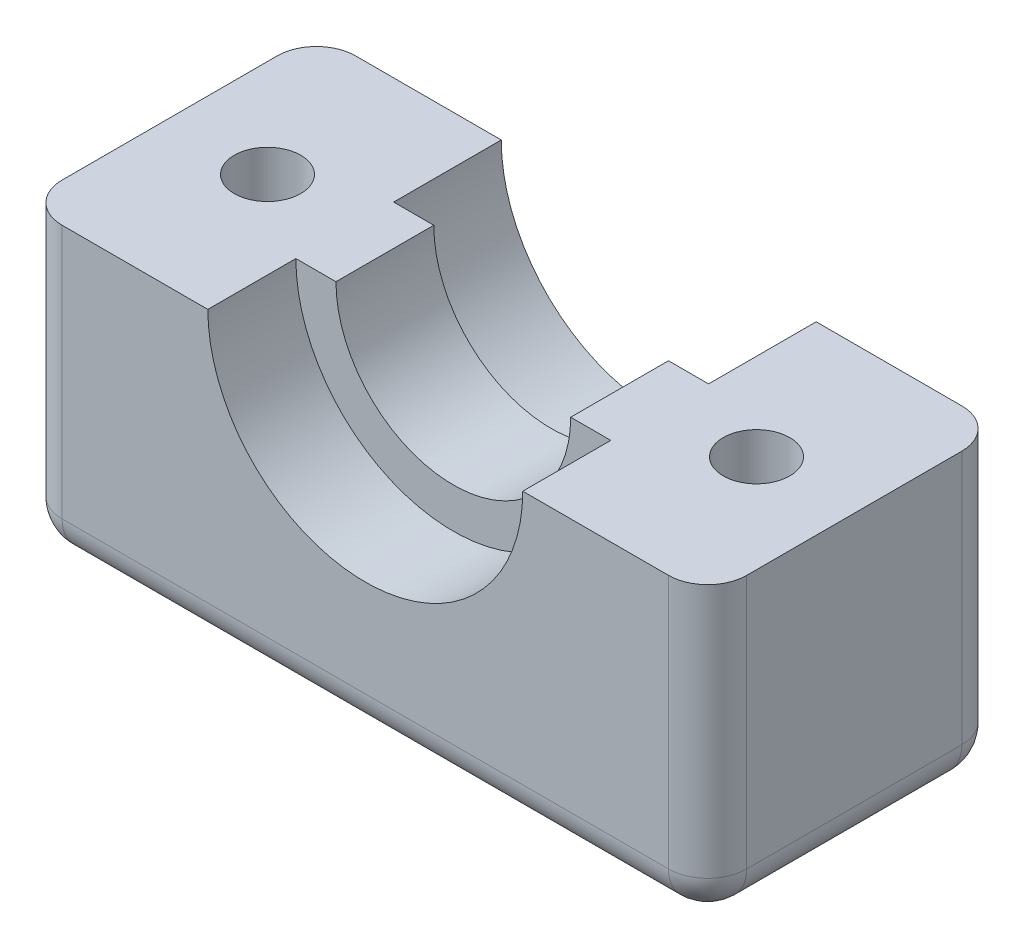
ISO-10303-21;
HEADER;
FILE_DESCRIPTION(('STEP AP214'),'2;1');
FILE_NAME('part.step','',(''),(''),'','','');
FILE_SCHEMA(('AUTOMOTIVE_DESIGN { 1 0 10303 214 1 1 1 1 }'));
ENDSEC;
DATA;
#1=APPLICATION_CONTEXT('core data for automotive mechanical design processes');
#2=APPLICATION_PROTOCOL_DEFINITION('international standard','automotive_design',2000,#1);
#3=PRODUCT_CONTEXT('',#1,'mechanical');
#4=PRODUCT('Part','Part','',(#3));
#5=PRODUCT_RELATED_PRODUCT_CATEGORY('part','',(#4));
#6=PRODUCT_DEFINITION_FORMATION('','',#4);
#7=PRODUCT_DEFINITION_CONTEXT('part definition',#1,'design');
#8=PRODUCT_DEFINITION('design','',#6,#7);
#9=PRODUCT_DEFINITION_SHAPE('','',#8);
#10=(LENGTH_UNIT() NAMED_UNIT(*) SI_UNIT(.MILLI.,.METRE.));
#11=(NAMED_UNIT(*) PLANE_ANGLE_UNIT() SI_UNIT($,.RADIAN.));
#12=(NAMED_UNIT(*) SI_UNIT($,.STERADIAN.) SOLID_ANGLE_UNIT());
#13=UNCERTAINTY_MEASURE_WITH_UNIT(LENGTH_MEASURE(1.E-05),#10,'distance_accuracy_value','');
#14=(GEOMETRIC_REPRESENTATION_CONTEXT(3) GLOBAL_UNCERTAINTY_ASSIGNED_CONTEXT((#13)) GLOBAL_UNIT_ASSIGNED_CONTEXT((#10,
#11,#12)) REPRESENTATION_CONTEXT('',''));
#15=CARTESIAN_POINT('',(0.,0.,0.));
#16=DIRECTION('',(0.,0.,1.));
#17=DIRECTION('',(1.,0.,0.));
#18=AXIS2_PLACEMENT_3D('',#15,#16,#17);
#19=CARTESIAN_POINT('',(2.,-89.498,191.5));
#20=DIRECTION('',(0.,-1.,0.));
#21=DIRECTION('',(0.,0.,-1.));
#22=AXIS2_PLACEMENT_3D('',#19,#20,#21);
#23=CYLINDRICAL_SURFACE('',#22,1.7);
#24=CARTESIAN_POINT('',(2.,-111.5,191.5));
#25=DIRECTION('',(0.,-1.,0.));
#26=DIRECTION('',(0.,0.,-1.));
#27=AXIS2_PLACEMENT_3D('',#24,#25,#26);
#28=CIRCLE('',#27,1.7);
#29=CARTESIAN_POINT('',(2.,-111.5,189.8));
#30=VERTEX_POINT('',#29);
#31=EDGE_CURVE('E356',#30,#30,#28,.T.);
#32=ORIENTED_EDGE('',*,*,#31,.F.);
#33=EDGE_LOOP('',(#32));
#34=FACE_BOUND('',#33,.T.);
#35=CARTESIAN_POINT('',(2.,-118.5,191.5));
#36=DIRECTION('',(0.,-1.,0.));
#37=DIRECTION('',(0.,0.,-1.));
#38=AXIS2_PLACEMENT_3D('',#35,#36,#37);
#39=CIRCLE('',#38,1.7);
#40=CARTESIAN_POINT('',(2.,-118.5,189.8));
#41=VERTEX_POINT('',#40);
#42=EDGE_CURVE('E344',#41,#41,#39,.T.);
#43=ORIENTED_EDGE('',*,*,#42,.T.);
#44=EDGE_LOOP('',(#43));
#45=FACE_BOUND('',#44,.T.);
#46=ADVANCED_FACE('F16',(#34,#45),#23,.F.);
#47=CARTESIAN_POINT('',(-23.,-89.498,191.5));
#48=DIRECTION('',(0.,-1.,0.));
#49=DIRECTION('',(0.,0.,-1.));
#50=AXIS2_PLACEMENT_3D('',#47,#48,#49);
#51=CYLINDRICAL_SURFACE('',#50,1.7);
#52=CARTESIAN_POINT('',(-23.,-111.5,191.5));
#53=DIRECTION('',(0.,-1.,0.));
#54=DIRECTION('',(0.,0.,-1.));
#55=AXIS2_PLACEMENT_3D('',#52,#53,#54);
#56=CIRCLE('',#55,1.7);
#57=CARTESIAN_POINT('',(-23.,-111.5,189.8));
#58=VERTEX_POINT('',#57);
#59=EDGE_CURVE('E187',#58,#58,#56,.T.);
#60=ORIENTED_EDGE('',*,*,#59,.F.);
#61=EDGE_LOOP('',(#60));
#62=FACE_BOUND('',#61,.T.);
#63=CARTESIAN_POINT('',(-23.,-118.5,191.5));
#64=DIRECTION('',(0.,-1.,0.));
#65=DIRECTION('',(0.,0.,-1.));
#66=AXIS2_PLACEMENT_3D('',#63,#64,#65);
#67=CIRCLE('',#66,1.7);
#68=CARTESIAN_POINT('',(-23.,-118.5,189.8));
#69=VERTEX_POINT('',#68);
#70=EDGE_CURVE('E360',#69,#69,#67,.T.);
#71=ORIENTED_EDGE('',*,*,#70,.T.);
#72=EDGE_LOOP('',(#71));
#73=FACE_BOUND('',#72,.T.);
#74=ADVANCED_FACE('F485',(#62,#73),#51,.F.);
#75=CARTESIAN_POINT('',(-10.5,-111.5,171.));
#76=DIRECTION('',(0.,-1.,0.));
#77=DIRECTION('',(1.,0.,0.));
#78=AXIS2_PLACEMENT_3D('',#75,#76,#77);
#79=PLANE('',#78);
#80=ORIENTED_EDGE('',*,*,#31,.T.);
#81=EDGE_LOOP('',(#80));
#82=FACE_BOUND('',#81,.T.);
#83=DIRECTION('',(-1.,0.,0.));
#84=VECTOR('',#83,1.);
#85=CARTESIAN_POINT('',(-10.5,-111.5,199.));
#86=LINE('',#85,#84);
#87=CARTESIAN_POINT('',(5.,-111.5,199.));
#88=VERTEX_POINT('',#87);
#89=CARTESIAN_POINT('',(-2.45,-111.5,199.));
#90=VERTEX_POINT('',#89);
#91=EDGE_CURVE('E215',#88,#90,#86,.T.);
#92=ORIENTED_EDGE('',*,*,#91,.F.);
#93=CARTESIAN_POINT('',(5.,-111.5,197.));
#94=DIRECTION('',(0.,-1.,0.));
#95=DIRECTION('',(0.,0.,-1.));
#96=AXIS2_PLACEMENT_3D('',#93,#94,#95);
#97=CIRCLE('',#96,2.);
#98=CARTESIAN_POINT('',(7.,-111.5,197.));
#99=VERTEX_POINT('',#98);
#100=EDGE_CURVE('E239',#88,#99,#97,.F.);
#101=ORIENTED_EDGE('',*,*,#100,.T.);
#102=DIRECTION('',(0.,0.,-1.));
#103=VECTOR('',#102,1.);
#104=CARTESIAN_POINT('',(7.,-111.5,191.5));
#105=LINE('',#104,#103);
#106=CARTESIAN_POINT('',(7.,-111.5,186.));
#107=VERTEX_POINT('',#106);
#108=EDGE_CURVE('E399',#99,#107,#105,.T.);
#109=ORIENTED_EDGE('',*,*,#108,.T.);
#110=CARTESIAN_POINT('',(5.,-111.5,186.));
#111=DIRECTION('',(0.,-1.,0.));
#112=DIRECTION('',(0.,0.,-1.));
#113=AXIS2_PLACEMENT_3D('',#110,#111,#112);
#114=CIRCLE('',#113,2.);
#115=CARTESIAN_POINT('',(5.,-111.5,184.));
#116=VERTEX_POINT('',#115);
#117=EDGE_CURVE('E236',#107,#116,#114,.F.);
#118=ORIENTED_EDGE('',*,*,#117,.T.);
#119=DIRECTION('',(-1.,0.,0.));
#120=VECTOR('',#119,1.);
#121=CARTESIAN_POINT('',(-10.5,-111.5,184.));
#122=LINE('',#121,#120);
#123=CARTESIAN_POINT('',(-2.45,-111.5,184.));
#124=VERTEX_POINT('',#123);
#125=EDGE_CURVE('E205',#116,#124,#122,.T.);
#126=ORIENTED_EDGE('',*,*,#125,.T.);
#127=DIRECTION('',(0.,0.,-1.));
#128=VECTOR('',#127,1.);
#129=CARTESIAN_POINT('',(-2.45,-111.5,189.5));
#130=LINE('',#129,#128);
#131=CARTESIAN_POINT('',(-2.45,-111.5,189.5));
#132=VERTEX_POINT('',#131);
#133=EDGE_CURVE('E181',#132,#124,#130,.T.);
#134=ORIENTED_EDGE('',*,*,#133,.F.);
#135=DIRECTION('',(1.,0.,0.));
#136=VECTOR('',#135,1.);
#137=CARTESIAN_POINT('',(-10.5,-111.5,189.5));
#138=LINE('',#137,#136);
#139=CARTESIAN_POINT('',(-4.5,-111.5,189.5));
#140=VERTEX_POINT('',#139);
#141=EDGE_CURVE('E371',#140,#132,#138,.T.);
#142=ORIENTED_EDGE('',*,*,#141,.F.);
#143=DIRECTION('',(0.,0.,1.));
#144=VECTOR('',#143,1.);
#145=CARTESIAN_POINT('',(-4.5,-111.5,174.));
#146=LINE('',#145,#144);
#147=CARTESIAN_POINT('',(-4.5,-111.5,194.5));
#148=VERTEX_POINT('',#147);
#149=EDGE_CURVE('E221',#140,#148,#146,.T.);
#150=ORIENTED_EDGE('',*,*,#149,.T.);
#151=DIRECTION('',(-1.,0.,0.));
#152=VECTOR('',#151,1.);
#153=CARTESIAN_POINT('',(-10.5,-111.5,194.5));
#154=LINE('',#153,#152);
#155=CARTESIAN_POINT('',(-2.45,-111.5,194.5));
#156=VERTEX_POINT('',#155);
#157=EDGE_CURVE('E391',#156,#148,#154,.T.);
#158=ORIENTED_EDGE('',*,*,#157,.F.);
#159=DIRECTION('',(0.,0.,1.));
#160=VECTOR('',#159,1.);
#161=CARTESIAN_POINT('',(-2.45,-111.5,194.5));
#162=LINE('',#161,#160);
#163=EDGE_CURVE('E395',#156,#90,#162,.T.);
#164=ORIENTED_EDGE('',*,*,#163,.T.);
#165=EDGE_LOOP('',(#92,#101,#109,#118,#126,#134,#142,#150,#158,#164));
#166=FACE_BOUND('',#165,.T.);
#167=ADVANCED_FACE('F430',(#82,#166),#79,.F.);
#168=ORIENTED_EDGE('',*,*,#59,.T.);
#169=EDGE_LOOP('',(#168));
#170=FACE_BOUND('',#169,.T.);
#171=DIRECTION('',(0.,0.,-1.));
#172=VECTOR('',#171,1.);
#173=CARTESIAN_POINT('',(-28.,-111.5,191.5));
#174=LINE('',#173,#172);
#175=CARTESIAN_POINT('',(-28.,-111.5,197.));
#176=VERTEX_POINT('',#175);
#177=CARTESIAN_POINT('',(-28.,-111.5,186.));
#178=VERTEX_POINT('',#177);
#179=EDGE_CURVE('E206',#176,#178,#174,.T.);
#180=ORIENTED_EDGE('',*,*,#179,.F.);
#181=CARTESIAN_POINT('',(-26.,-111.5,197.));
#182=DIRECTION('',(0.,-1.,0.));
#183=DIRECTION('',(0.,0.,-1.));
#184=AXIS2_PLACEMENT_3D('',#181,#182,#183);
#185=CIRCLE('',#184,2.);
#186=CARTESIAN_POINT('',(-26.,-111.5,199.));
#187=VERTEX_POINT('',#186);
#188=EDGE_CURVE('E263',#176,#187,#185,.F.);
#189=ORIENTED_EDGE('',*,*,#188,.T.);
#190=CARTESIAN_POINT('',(-18.55,-111.5,199.));
#191=VERTEX_POINT('',#190);
#192=EDGE_CURVE('E402',#191,#187,#86,.T.);
#193=ORIENTED_EDGE('',*,*,#192,.F.);
#194=DIRECTION('',(0.,0.,1.));
#195=VECTOR('',#194,1.);
#196=CARTESIAN_POINT('',(-18.55,-111.5,194.5));
#197=LINE('',#196,#195);
#198=CARTESIAN_POINT('',(-18.55,-111.5,194.5));
#199=VERTEX_POINT('',#198);
#200=EDGE_CURVE('E199',#191,#199,#197,.F.);
#201=ORIENTED_EDGE('',*,*,#200,.T.);
#202=DIRECTION('',(-1.,0.,0.));
#203=VECTOR('',#202,1.);
#204=CARTESIAN_POINT('',(-10.5,-111.5,194.5));
#205=LINE('',#204,#203);
#206=CARTESIAN_POINT('',(-16.5,-111.5,194.5));
#207=VERTEX_POINT('',#206);
#208=EDGE_CURVE('E385',#207,#199,#205,.T.);
#209=ORIENTED_EDGE('',*,*,#208,.F.);
#210=DIRECTION('',(0.,0.,1.));
#211=VECTOR('',#210,1.);
#212=CARTESIAN_POINT('',(-16.5,-111.5,174.));
#213=LINE('',#212,#211);
#214=CARTESIAN_POINT('',(-16.5,-111.5,189.5));
#215=VERTEX_POINT('',#214);
#216=EDGE_CURVE('E212',#207,#215,#213,.F.);
#217=ORIENTED_EDGE('',*,*,#216,.T.);
#218=DIRECTION('',(1.,0.,0.));
#219=VECTOR('',#218,1.);
#220=CARTESIAN_POINT('',(-10.5,-111.5,189.5));
#221=LINE('',#220,#219);
#222=CARTESIAN_POINT('',(-18.55,-111.5,189.5));
#223=VERTEX_POINT('',#222);
#224=EDGE_CURVE('E196',#223,#215,#221,.T.);
#225=ORIENTED_EDGE('',*,*,#224,.F.);
#226=DIRECTION('',(0.,0.,-1.));
#227=VECTOR('',#226,1.);
#228=CARTESIAN_POINT('',(-18.55,-111.5,189.5));
#229=LINE('',#228,#227);
#230=CARTESIAN_POINT('',(-18.55,-111.5,184.));
#231=VERTEX_POINT('',#230);
#232=EDGE_CURVE('E178',#231,#223,#229,.F.);
#233=ORIENTED_EDGE('',*,*,#232,.F.);
#234=CARTESIAN_POINT('',(-26.,-111.5,184.));
#235=VERTEX_POINT('',#234);
#236=EDGE_CURVE('E193',#231,#235,#122,.T.);
#237=ORIENTED_EDGE('',*,*,#236,.T.);
#238=CARTESIAN_POINT('',(-26.,-111.5,186.));
#239=DIRECTION('',(0.,-1.,0.));
#240=DIRECTION('',(0.,0.,-1.));
#241=AXIS2_PLACEMENT_3D('',#238,#239,#240);
#242=CIRCLE('',#241,2.);
#243=EDGE_CURVE('E260',#235,#178,#242,.F.);
#244=ORIENTED_EDGE('',*,*,#243,.T.);
#245=EDGE_LOOP('',(#180,#189,#193,#201,#209,#217,#225,#233,#237,#244));
#246=FACE_BOUND('',#245,.T.);
#247=ADVANCED_FACE('F192',(#170,#246),#79,.F.);
#248=CARTESIAN_POINT('',(-10.5,-111.5,174.));
#249=DIRECTION('',(0.,0.,1.));
#250=DIRECTION('',(1.,0.,0.));
#251=AXIS2_PLACEMENT_3D('',#248,#249,#250);
#252=CYLINDRICAL_SURFACE('',#251,6.);
#253=CARTESIAN_POINT('',(-10.5,-111.5,189.5));
#254=DIRECTION('',(0.,0.,1.));
#255=DIRECTION('',(-1.,0.,0.));
#256=AXIS2_PLACEMENT_3D('',#253,#254,#255);
#257=CIRCLE('',#256,6.);
#258=EDGE_CURVE('E366',#215,#140,#257,.T.);
#259=ORIENTED_EDGE('',*,*,#258,.F.);
#260=ORIENTED_EDGE('',*,*,#216,.F.);
#261=CARTESIAN_POINT('',(-10.5,-111.5,194.5));
#262=DIRECTION('',(0.,0.,1.));
#263=DIRECTION('',(1.,0.,0.));
#264=AXIS2_PLACEMENT_3D('',#261,#262,#263);
#265=CIRCLE('',#264,6.);
#266=EDGE_CURVE('E381',#207,#148,#265,.T.);
#267=ORIENTED_EDGE('',*,*,#266,.T.);
#268=ORIENTED_EDGE('',*,*,#149,.F.);
#269=EDGE_LOOP('',(#259,#260,#267,#268));
#270=FACE_BOUND('',#269,.T.);
#271=ADVANCED_FACE('F442',(#270),#252,.F.);
#272=CARTESIAN_POINT('',(-10.5,-126.5,199.));
#273=DIRECTION('',(0.,0.,-1.));
#274=DIRECTION('',(-1.,0.,0.));
#275=AXIS2_PLACEMENT_3D('',#272,#273,#274);
#276=PLANE('',#275);
#277=DIRECTION('',(-1.,0.,0.));
#278=VECTOR('',#277,1.);
#279=CARTESIAN_POINT('',(7.,-124.5,199.));
#280=LINE('',#279,#278);
#281=CARTESIAN_POINT('',(-26.,-124.5,199.));
#282=VERTEX_POINT('',#281);
#283=CARTESIAN_POINT('',(5.,-124.5,199.));
#284=VERTEX_POINT('',#283);
#285=EDGE_CURVE('E198',#282,#284,#280,.F.);
#286=ORIENTED_EDGE('',*,*,#285,.T.);
#287=DIRECTION('',(0.,1.,0.));
#288=VECTOR('',#287,1.);
#289=CARTESIAN_POINT('',(5.,-111.5,199.));
#290=LINE('',#289,#288);
#291=EDGE_CURVE('E232',#284,#88,#290,.T.);
#292=ORIENTED_EDGE('',*,*,#291,.T.);
#293=ORIENTED_EDGE('',*,*,#91,.T.);
#294=CARTESIAN_POINT('',(-10.5,-111.5,199.));
#295=DIRECTION('',(0.,0.,1.));
#296=DIRECTION('',(1.,0.,0.));
#297=AXIS2_PLACEMENT_3D('',#294,#295,#296);
#298=CIRCLE('',#297,8.05);
#299=EDGE_CURVE('E376',#191,#90,#298,.T.);
#300=ORIENTED_EDGE('',*,*,#299,.F.);
#301=ORIENTED_EDGE('',*,*,#192,.T.);
#302=DIRECTION('',(0.,1.,0.));
#303=VECTOR('',#302,1.);
#304=CARTESIAN_POINT('',(-26.,-126.5,199.));
#305=LINE('',#304,#303);
#306=EDGE_CURVE('E229',#187,#282,#305,.F.);
#307=ORIENTED_EDGE('',*,*,#306,.T.);
#308=EDGE_LOOP('',(#286,#292,#293,#300,#301,#307));
#309=FACE_BOUND('',#308,.T.);
#310=ADVANCED_FACE('F412',(#309),#276,.F.);
#311=CARTESIAN_POINT('',(7.,-126.5,191.5));
#312=DIRECTION('',(1.,0.,0.));
#313=DIRECTION('',(0.,0.,-1.));
#314=AXIS2_PLACEMENT_3D('',#311,#312,#313);
#315=PLANE('',#314);
#316=ORIENTED_EDGE('',*,*,#108,.F.);
#317=DIRECTION('',(0.,1.,0.));
#318=VECTOR('',#317,1.);
#319=CARTESIAN_POINT('',(7.,-126.5,197.));
#320=LINE('',#319,#318);
#321=CARTESIAN_POINT('',(7.,-124.5,197.));
#322=VERTEX_POINT('',#321);
#323=EDGE_CURVE('E248',#99,#322,#320,.F.);
#324=ORIENTED_EDGE('',*,*,#323,.T.);
#325=DIRECTION('',(0.,0.,-1.));
#326=VECTOR('',#325,1.);
#327=CARTESIAN_POINT('',(7.,-124.5,191.5));
#328=LINE('',#327,#326);
#329=CARTESIAN_POINT('',(7.,-124.5,186.));
#330=VERTEX_POINT('',#329);
#331=EDGE_CURVE('E242',#322,#330,#328,.T.);
#332=ORIENTED_EDGE('',*,*,#331,.T.);
#333=DIRECTION('',(0.,1.,0.));
#334=VECTOR('',#333,1.);
#335=CARTESIAN_POINT('',(7.,-126.5,186.));
#336=LINE('',#335,#334);
#337=EDGE_CURVE('E245',#330,#107,#336,.T.);
#338=ORIENTED_EDGE('',*,*,#337,.T.);
#339=EDGE_LOOP('',(#316,#324,#332,#338));
#340=FACE_BOUND('',#339,.T.);
#341=ADVANCED_FACE('F531',(#340),#315,.T.);
#342=CARTESIAN_POINT('',(-28.,-126.5,191.5));
#343=DIRECTION('',(1.,0.,0.));
#344=DIRECTION('',(0.,0.,-1.));
#345=AXIS2_PLACEMENT_3D('',#342,#343,#344);
#346=PLANE('',#345);
#347=DIRECTION('',(0.,0.,-1.));
#348=VECTOR('',#347,1.);
#349=CARTESIAN_POINT('',(-28.,-124.5,199.));
#350=LINE('',#349,#348);
#351=CARTESIAN_POINT('',(-28.,-124.5,186.));
#352=VERTEX_POINT('',#351);
#353=CARTESIAN_POINT('',(-28.,-124.5,197.));
#354=VERTEX_POINT('',#353);
#355=EDGE_CURVE('E251',#352,#354,#350,.F.);
#356=ORIENTED_EDGE('',*,*,#355,.T.);
#357=DIRECTION('',(0.,1.,0.));
#358=VECTOR('',#357,1.);
#359=CARTESIAN_POINT('',(-28.,-126.5,197.));
#360=LINE('',#359,#358);
#361=EDGE_CURVE('E257',#354,#176,#360,.T.);
#362=ORIENTED_EDGE('',*,*,#361,.T.);
#363=ORIENTED_EDGE('',*,*,#179,.T.);
#364=DIRECTION('',(0.,1.,0.));
#365=VECTOR('',#364,1.);
#366=CARTESIAN_POINT('',(-28.,-126.5,186.));
#367=LINE('',#366,#365);
#368=EDGE_CURVE('E254',#178,#352,#367,.F.);
#369=ORIENTED_EDGE('',*,*,#368,.T.);
#370=EDGE_LOOP('',(#356,#362,#363,#369));
#371=FACE_BOUND('',#370,.T.);
#372=ADVANCED_FACE('F462',(#371),#346,.F.);
#373=CARTESIAN_POINT('',(-10.5,-126.5,184.));
#374=DIRECTION('',(0.,0.,-1.));
#375=DIRECTION('',(-1.,0.,0.));
#376=AXIS2_PLACEMENT_3D('',#373,#374,#375);
#377=PLANE('',#376);
#378=DIRECTION('',(-1.,0.,0.));
#379=VECTOR('',#378,1.);
#380=CARTESIAN_POINT('',(-10.5,-124.5,184.));
#381=LINE('',#380,#379);
#382=CARTESIAN_POINT('',(5.,-124.5,184.));
#383=VERTEX_POINT('',#382);
#384=CARTESIAN_POINT('',(-26.,-124.5,184.));
#385=VERTEX_POINT('',#384);
#386=EDGE_CURVE('E266',#383,#385,#381,.T.);
#387=ORIENTED_EDGE('',*,*,#386,.T.);
#388=DIRECTION('',(0.,1.,0.));
#389=VECTOR('',#388,1.);
#390=CARTESIAN_POINT('',(-26.,-111.5,184.));
#391=LINE('',#390,#389);
#392=EDGE_CURVE('E203',#385,#235,#391,.T.);
#393=ORIENTED_EDGE('',*,*,#392,.T.);
#394=ORIENTED_EDGE('',*,*,#236,.F.);
#395=CARTESIAN_POINT('',(-10.5,-111.5,184.));
#396=DIRECTION('',(0.,0.,1.));
#397=DIRECTION('',(-1.,0.,0.));
#398=AXIS2_PLACEMENT_3D('',#395,#396,#397);
#399=CIRCLE('',#398,8.05);
#400=EDGE_CURVE('E174',#231,#124,#399,.T.);
#401=ORIENTED_EDGE('',*,*,#400,.T.);
#402=ORIENTED_EDGE('',*,*,#125,.F.);
#403=DIRECTION('',(0.,1.,0.));
#404=VECTOR('',#403,1.);
#405=CARTESIAN_POINT('',(5.,-126.5,184.));
#406=LINE('',#405,#404);
#407=EDGE_CURVE('E269',#116,#383,#406,.F.);
#408=ORIENTED_EDGE('',*,*,#407,.T.);
#409=EDGE_LOOP('',(#387,#393,#394,#401,#402,#408));
#410=FACE_BOUND('',#409,.T.);
#411=ADVANCED_FACE('F201',(#410),#377,.T.);
#412=CARTESIAN_POINT('',(-10.5,-126.5,171.));
#413=DIRECTION('',(0.,-1.,0.));
#414=DIRECTION('',(1.,0.,0.));
#415=AXIS2_PLACEMENT_3D('',#412,#413,#414);
#416=PLANE('',#415);
#417=DIRECTION('',(0.,0.,-1.));
#418=VECTOR('',#417,1.);
#419=CARTESIAN_POINT('',(5.,-126.5,171.));
#420=LINE('',#419,#418);
#421=CARTESIAN_POINT('',(5.,-126.5,191.5));
#422=VERTEX_POINT('',#421);
#423=CARTESIAN_POINT('',(5.,-126.5,197.));
#424=VERTEX_POINT('',#423);
#425=EDGE_CURVE('E26',#422,#424,#420,.F.);
#426=ORIENTED_EDGE('',*,*,#425,.T.);
#427=DIRECTION('',(-1.,0.,0.));
#428=VECTOR('',#427,1.);
#429=CARTESIAN_POINT('',(-28.,-126.5,197.));
#430=LINE('',#429,#428);
#431=CARTESIAN_POINT('',(-26.,-126.5,197.));
#432=VERTEX_POINT('',#431);
#433=EDGE_CURVE('E10',#424,#432,#430,.T.);
#434=ORIENTED_EDGE('',*,*,#433,.T.);
#435=DIRECTION('',(0.,0.,-1.));
#436=VECTOR('',#435,1.);
#437=CARTESIAN_POINT('',(-26.,-126.5,184.));
#438=LINE('',#437,#436);
#439=CARTESIAN_POINT('',(-26.,-126.5,191.5));
#440=VERTEX_POINT('',#439);
#441=EDGE_CURVE('E283',#432,#440,#438,.T.);
#442=ORIENTED_EDGE('',*,*,#441,.T.);
#443=CARTESIAN_POINT('',(-23.,-126.5,191.5));
#444=DIRECTION('',(0.,-1.,0.));
#445=DIRECTION('',(0.,0.,-1.));
#446=AXIS2_PLACEMENT_3D('',#443,#444,#445);
#447=CIRCLE('',#446,3.);
#448=EDGE_CURVE('E469',#440,#440,#447,.T.);
#449=ORIENTED_EDGE('',*,*,#448,.F.);
#450=DIRECTION('',(0.,0.,-1.));
#451=VECTOR('',#450,1.);
#452=CARTESIAN_POINT('',(-26.,-126.5,184.));
#453=LINE('',#452,#451);
#454=CARTESIAN_POINT('',(-26.,-126.5,186.));
#455=VERTEX_POINT('',#454);
#456=EDGE_CURVE('E280',#440,#455,#453,.T.);
#457=ORIENTED_EDGE('',*,*,#456,.T.);
#458=DIRECTION('',(-1.,0.,0.));
#459=VECTOR('',#458,1.);
#460=CARTESIAN_POINT('',(-10.5,-126.5,186.));
#461=LINE('',#460,#459);
#462=CARTESIAN_POINT('',(5.,-126.5,186.));
#463=VERTEX_POINT('',#462);
#464=EDGE_CURVE('E274',#455,#463,#461,.F.);
#465=ORIENTED_EDGE('',*,*,#464,.T.);
#466=DIRECTION('',(0.,0.,-1.));
#467=VECTOR('',#466,1.);
#468=CARTESIAN_POINT('',(5.,-126.5,171.));
#469=LINE('',#468,#467);
#470=EDGE_CURVE('E277',#463,#422,#469,.F.);
#471=ORIENTED_EDGE('',*,*,#470,.T.);
#472=CARTESIAN_POINT('',(2.,-126.5,191.5));
#473=DIRECTION('',(0.,-1.,0.));
#474=DIRECTION('',(0.,0.,-1.));
#475=AXIS2_PLACEMENT_3D('',#472,#473,#474);
#476=CIRCLE('',#475,3.);
#477=EDGE_CURVE('E337',#422,#422,#476,.T.);
#478=ORIENTED_EDGE('',*,*,#477,.F.);
#479=EDGE_LOOP('',(#426,#434,#442,#449,#457,#465,#471,#478));
#480=FACE_BOUND('',#479,.T.);
#481=ADVANCED_FACE('F468',(#480),#416,.T.);
#482=CARTESIAN_POINT('',(-10.5,-111.5,194.5));
#483=DIRECTION('',(0.,0.,1.));
#484=DIRECTION('',(1.,0.,0.));
#485=AXIS2_PLACEMENT_3D('',#482,#483,#484);
#486=CYLINDRICAL_SURFACE('',#485,8.05);
#487=CARTESIAN_POINT('',(-10.5,-111.5,194.5));
#488=DIRECTION('',(0.,0.,1.));
#489=DIRECTION('',(1.,0.,0.));
#490=AXIS2_PLACEMENT_3D('',#487,#488,#489);
#491=CIRCLE('',#490,8.05);
#492=EDGE_CURVE('E377',#199,#156,#491,.T.);
#493=ORIENTED_EDGE('',*,*,#492,.F.);
#494=ORIENTED_EDGE('',*,*,#200,.F.);
#495=ORIENTED_EDGE('',*,*,#299,.T.);
#496=ORIENTED_EDGE('',*,*,#163,.F.);
#497=EDGE_LOOP('',(#493,#494,#495,#496));
#498=FACE_BOUND('',#497,.T.);
#499=ADVANCED_FACE('F435',(#498),#486,.F.);
#500=CARTESIAN_POINT('',(-10.5,-107.025,194.5));
#501=DIRECTION('',(0.,0.,1.));
#502=DIRECTION('',(1.,0.,0.));
#503=AXIS2_PLACEMENT_3D('',#500,#501,#502);
#504=PLANE('',#503);
#505=ORIENTED_EDGE('',*,*,#157,.T.);
#506=ORIENTED_EDGE('',*,*,#266,.F.);
#507=ORIENTED_EDGE('',*,*,#208,.T.);
#508=ORIENTED_EDGE('',*,*,#492,.T.);
#509=EDGE_LOOP('',(#505,#506,#507,#508));
#510=FACE_BOUND('',#509,.T.);
#511=ADVANCED_FACE('F437',(#510),#504,.T.);
#512=CARTESIAN_POINT('',(-10.5,-111.5,189.5));
#513=DIRECTION('',(0.,0.,-1.));
#514=DIRECTION('',(-1.,0.,0.));
#515=AXIS2_PLACEMENT_3D('',#512,#513,#514);
#516=CYLINDRICAL_SURFACE('',#515,8.05);
#517=ORIENTED_EDGE('',*,*,#133,.T.);
#518=ORIENTED_EDGE('',*,*,#400,.F.);
#519=ORIENTED_EDGE('',*,*,#232,.T.);
#520=CARTESIAN_POINT('',(-10.5,-111.5,189.5));
#521=DIRECTION('',(0.,0.,1.));
#522=DIRECTION('',(-1.,0.,0.));
#523=AXIS2_PLACEMENT_3D('',#520,#521,#522);
#524=CIRCLE('',#523,8.05);
#525=EDGE_CURVE('E186',#223,#132,#524,.T.);
#526=ORIENTED_EDGE('',*,*,#525,.T.);
#527=EDGE_LOOP('',(#517,#518,#519,#526));
#528=FACE_BOUND('',#527,.T.);
#529=ADVANCED_FACE('F176',(#528),#516,.F.);
#530=CARTESIAN_POINT('',(-10.5,-114.975,189.5));
#531=DIRECTION('',(0.,0.,-1.));
#532=DIRECTION('',(1.,0.,0.));
#533=AXIS2_PLACEMENT_3D('',#530,#531,#532);
#534=PLANE('',#533);
#535=ORIENTED_EDGE('',*,*,#141,.T.);
#536=ORIENTED_EDGE('',*,*,#525,.F.);
#537=ORIENTED_EDGE('',*,*,#224,.T.);
#538=ORIENTED_EDGE('',*,*,#258,.T.);
#539=EDGE_LOOP('',(#535,#536,#537,#538));
#540=FACE_BOUND('',#539,.T.);
#541=ADVANCED_FACE('F446',(#540),#534,.T.);
#542=CARTESIAN_POINT('',(-23.,-118.5,191.5));
#543=DIRECTION('',(0.,-1.,0.));
#544=DIRECTION('',(0.,0.,-1.));
#545=AXIS2_PLACEMENT_3D('',#542,#543,#544);
#546=CYLINDRICAL_SURFACE('',#545,3.);
#547=CARTESIAN_POINT('',(-23.,-118.5,191.5));
#548=DIRECTION('',(0.,-1.,0.));
#549=DIRECTION('',(0.,0.,-1.));
#550=AXIS2_PLACEMENT_3D('',#547,#548,#549);
#551=CIRCLE('',#550,3.);
#552=CARTESIAN_POINT('',(-23.,-118.5,188.5));
#553=VERTEX_POINT('',#552);
#554=EDGE_CURVE('E473',#553,#553,#551,.T.);
#555=ORIENTED_EDGE('',*,*,#554,.F.);
#556=EDGE_LOOP('',(#555));
#557=FACE_BOUND('',#556,.T.);
#558=ORIENTED_EDGE('',*,*,#448,.T.);
#559=EDGE_LOOP('',(#558));
#560=FACE_BOUND('',#559,.T.);
#561=ADVANCED_FACE('F471',(#557,#560),#546,.F.);
#562=CARTESIAN_POINT('',(-10.5,-118.5,191.5));
#563=DIRECTION('',(0.,-1.,0.));
#564=DIRECTION('',(1.,0.,0.));
#565=AXIS2_PLACEMENT_3D('',#562,#563,#564);
#566=PLANE('',#565);
#567=ORIENTED_EDGE('',*,*,#70,.F.);
#568=EDGE_LOOP('',(#567));
#569=FACE_BOUND('',#568,.T.);
#570=ORIENTED_EDGE('',*,*,#554,.T.);
#571=EDGE_LOOP('',(#570));
#572=FACE_BOUND('',#571,.T.);
#573=ADVANCED_FACE('F487',(#569,#572),#566,.T.);
#574=CARTESIAN_POINT('',(2.,-118.5,191.5));
#575=DIRECTION('',(0.,-1.,0.));
#576=DIRECTION('',(0.,0.,-1.));
#577=AXIS2_PLACEMENT_3D('',#574,#575,#576);
#578=CYLINDRICAL_SURFACE('',#577,3.);
#579=CARTESIAN_POINT('',(2.,-118.5,191.5));
#580=DIRECTION('',(0.,-1.,0.));
#581=DIRECTION('',(0.,0.,-1.));
#582=AXIS2_PLACEMENT_3D('',#579,#580,#581);
#583=CIRCLE('',#582,3.);
#584=CARTESIAN_POINT('',(2.,-118.5,188.5));
#585=VERTEX_POINT('',#584);
#586=EDGE_CURVE('E352',#585,#585,#583,.T.);
#587=ORIENTED_EDGE('',*,*,#586,.F.);
#588=EDGE_LOOP('',(#587));
#589=FACE_BOUND('',#588,.T.);
#590=ORIENTED_EDGE('',*,*,#477,.T.);
#591=EDGE_LOOP('',(#590));
#592=FACE_BOUND('',#591,.T.);
#593=ADVANCED_FACE('F490',(#589,#592),#578,.F.);
#594=CARTESIAN_POINT('',(-10.5,-118.5,191.5));
#595=DIRECTION('',(0.,-1.,0.));
#596=DIRECTION('',(1.,0.,0.));
#597=AXIS2_PLACEMENT_3D('',#594,#595,#596);
#598=PLANE('',#597);
#599=ORIENTED_EDGE('',*,*,#42,.F.);
#600=EDGE_LOOP('',(#599));
#601=FACE_BOUND('',#600,.T.);
#602=ORIENTED_EDGE('',*,*,#586,.T.);
#603=EDGE_LOOP('',(#602));
#604=FACE_BOUND('',#603,.T.);
#605=ADVANCED_FACE('F566',(#601,#604),#598,.T.);
#606=CARTESIAN_POINT('',(-26.,-126.5,186.));
#607=DIRECTION('',(0.,-1.,0.));
#608=DIRECTION('',(0.,0.,-1.));
#609=AXIS2_PLACEMENT_3D('',#606,#607,#608);
#610=CYLINDRICAL_SURFACE('',#609,2.);
#611=CARTESIAN_POINT('',(-26.,-124.5,186.));
#612=DIRECTION('',(0.,-1.,0.));
#613=DIRECTION('',(0.,0.,-1.));
#614=AXIS2_PLACEMENT_3D('',#611,#612,#613);
#615=CIRCLE('',#614,2.);
#616=EDGE_CURVE('E20',#352,#385,#615,.T.);
#617=ORIENTED_EDGE('',*,*,#616,.F.);
#618=ORIENTED_EDGE('',*,*,#368,.F.);
#619=ORIENTED_EDGE('',*,*,#243,.F.);
#620=ORIENTED_EDGE('',*,*,#392,.F.);
#621=EDGE_LOOP('',(#617,#618,#619,#620));
#622=FACE_BOUND('',#621,.T.);
#623=ADVANCED_FACE('F18',(#622),#610,.T.);
#624=CARTESIAN_POINT('',(-26.,-124.5,186.));
#625=DIRECTION('',(0.,0.,1.));
#626=DIRECTION('',(1.,0.,0.));
#627=AXIS2_PLACEMENT_3D('',#624,#625,#626);
#628=SPHERICAL_SURFACE('',#627,2.);
#629=CARTESIAN_POINT('',(-26.,-124.5,186.));
#630=DIRECTION('',(0.,0.,-1.));
#631=DIRECTION('',(-1.,0.,0.));
#632=AXIS2_PLACEMENT_3D('',#629,#630,#631);
#633=CIRCLE('',#632,2.);
#634=EDGE_CURVE('E324',#352,#455,#633,.F.);
#635=ORIENTED_EDGE('',*,*,#634,.F.);
#636=ORIENTED_EDGE('',*,*,#616,.T.);
#637=CARTESIAN_POINT('',(-26.,-124.5,186.));
#638=DIRECTION('',(-1.,0.,0.));
#639=DIRECTION('',(0.,-1.,0.));
#640=AXIS2_PLACEMENT_3D('',#637,#638,#639);
#641=CIRCLE('',#640,2.);
#642=EDGE_CURVE('E327',#455,#385,#641,.F.);
#643=ORIENTED_EDGE('',*,*,#642,.F.);
#644=EDGE_LOOP('',(#635,#636,#643));
#645=FACE_BOUND('',#644,.T.);
#646=ADVANCED_FACE('F561',(#645),#628,.T.);
#647=CARTESIAN_POINT('',(5.,-126.5,186.));
#648=DIRECTION('',(0.,1.,0.));
#649=DIRECTION('',(0.,0.,1.));
#650=AXIS2_PLACEMENT_3D('',#647,#648,#649);
#651=CYLINDRICAL_SURFACE('',#650,2.);
#652=ORIENTED_EDGE('',*,*,#117,.F.);
#653=ORIENTED_EDGE('',*,*,#337,.F.);
#654=CARTESIAN_POINT('',(5.,-124.5,186.));
#655=DIRECTION('',(0.,-1.,0.));
#656=DIRECTION('',(0.,0.,-1.));
#657=AXIS2_PLACEMENT_3D('',#654,#655,#656);
#658=CIRCLE('',#657,2.);
#659=EDGE_CURVE('E320',#383,#330,#658,.T.);
#660=ORIENTED_EDGE('',*,*,#659,.F.);
#661=ORIENTED_EDGE('',*,*,#407,.F.);
#662=EDGE_LOOP('',(#652,#653,#660,#661));
#663=FACE_BOUND('',#662,.T.);
#664=ADVANCED_FACE('F451',(#663),#651,.T.);
#665=CARTESIAN_POINT('',(-10.5,-124.5,186.));
#666=DIRECTION('',(-1.,0.,0.));
#667=DIRECTION('',(0.,0.,1.));
#668=AXIS2_PLACEMENT_3D('',#665,#666,#667);
#669=CYLINDRICAL_SURFACE('',#668,2.);
#670=ORIENTED_EDGE('',*,*,#642,.T.);
#671=ORIENTED_EDGE('',*,*,#386,.F.);
#672=CARTESIAN_POINT('',(5.,-124.5,186.));
#673=DIRECTION('',(1.,0.,0.));
#674=DIRECTION('',(0.,0.,-1.));
#675=AXIS2_PLACEMENT_3D('',#672,#673,#674);
#676=CIRCLE('',#675,2.);
#677=EDGE_CURVE('E316',#463,#383,#676,.T.);
#678=ORIENTED_EDGE('',*,*,#677,.F.);
#679=ORIENTED_EDGE('',*,*,#464,.F.);
#680=EDGE_LOOP('',(#670,#671,#678,#679));
#681=FACE_BOUND('',#680,.T.);
#682=ADVANCED_FACE('F458',(#681),#669,.T.);
#683=CARTESIAN_POINT('',(-26.,-124.5,171.));
#684=DIRECTION('',(0.,0.,1.));
#685=DIRECTION('',(1.,0.,0.));
#686=AXIS2_PLACEMENT_3D('',#683,#684,#685);
#687=CYLINDRICAL_SURFACE('',#686,2.);
#688=ORIENTED_EDGE('',*,*,#456,.F.);
#689=ORIENTED_EDGE('',*,*,#441,.F.);
#690=CARTESIAN_POINT('',(-26.,-124.5,197.));
#691=DIRECTION('',(0.,0.,1.));
#692=DIRECTION('',(1.,0.,0.));
#693=AXIS2_PLACEMENT_3D('',#690,#691,#692);
#694=CIRCLE('',#693,2.);
#695=EDGE_CURVE('E312',#354,#432,#694,.T.);
#696=ORIENTED_EDGE('',*,*,#695,.F.);
#697=ORIENTED_EDGE('',*,*,#355,.F.);
#698=ORIENTED_EDGE('',*,*,#634,.T.);
#699=EDGE_LOOP('',(#688,#689,#696,#697,#698));
#700=FACE_BOUND('',#699,.T.);
#701=ADVANCED_FACE('F465',(#700),#687,.T.);
#702=CARTESIAN_POINT('',(-26.,-126.5,197.));
#703=DIRECTION('',(0.,1.,0.));
#704=DIRECTION('',(0.,0.,1.));
#705=AXIS2_PLACEMENT_3D('',#702,#703,#704);
#706=CYLINDRICAL_SURFACE('',#705,2.);
#707=ORIENTED_EDGE('',*,*,#188,.F.);
#708=ORIENTED_EDGE('',*,*,#361,.F.);
#709=CARTESIAN_POINT('',(-26.,-124.5,197.));
#710=DIRECTION('',(0.,-1.,0.));
#711=DIRECTION('',(0.,0.,-1.));
#712=AXIS2_PLACEMENT_3D('',#709,#710,#711);
#713=CIRCLE('',#712,2.);
#714=EDGE_CURVE('E308',#282,#354,#713,.T.);
#715=ORIENTED_EDGE('',*,*,#714,.F.);
#716=ORIENTED_EDGE('',*,*,#306,.F.);
#717=EDGE_LOOP('',(#707,#708,#715,#716));
#718=FACE_BOUND('',#717,.T.);
#719=ADVANCED_FACE('F416',(#718),#706,.T.);
#720=CARTESIAN_POINT('',(5.,-124.5,186.));
#721=DIRECTION('',(0.,0.,1.));
#722=DIRECTION('',(1.,0.,0.));
#723=AXIS2_PLACEMENT_3D('',#720,#721,#722);
#724=SPHERICAL_SURFACE('',#723,2.);
#725=ORIENTED_EDGE('',*,*,#677,.T.);
#726=ORIENTED_EDGE('',*,*,#659,.T.);
#727=CARTESIAN_POINT('',(5.,-124.5,186.));
#728=DIRECTION('',(0.,0.,-1.));
#729=DIRECTION('',(-1.,0.,0.));
#730=AXIS2_PLACEMENT_3D('',#727,#728,#729);
#731=CIRCLE('',#730,2.);
#732=EDGE_CURVE('E304',#463,#330,#731,.F.);
#733=ORIENTED_EDGE('',*,*,#732,.F.);
#734=EDGE_LOOP('',(#725,#726,#733));
#735=FACE_BOUND('',#734,.T.);
#736=ADVANCED_FACE('F456',(#735),#724,.T.);
#737=CARTESIAN_POINT('',(-26.,-124.5,197.));
#738=DIRECTION('',(0.,0.,1.));
#739=DIRECTION('',(1.,0.,0.));
#740=AXIS2_PLACEMENT_3D('',#737,#738,#739);
#741=SPHERICAL_SURFACE('',#740,2.);
#742=ORIENTED_EDGE('',*,*,#714,.T.);
#743=ORIENTED_EDGE('',*,*,#695,.T.);
#744=CARTESIAN_POINT('',(-26.,-124.5,197.));
#745=DIRECTION('',(-1.,0.,0.));
#746=DIRECTION('',(0.,0.,1.));
#747=AXIS2_PLACEMENT_3D('',#744,#745,#746);
#748=CIRCLE('',#747,2.);
#749=EDGE_CURVE('E300',#282,#432,#748,.F.);
#750=ORIENTED_EDGE('',*,*,#749,.F.);
#751=EDGE_LOOP('',(#742,#743,#750));
#752=FACE_BOUND('',#751,.T.);
#753=ADVANCED_FACE('F422',(#752),#741,.T.);
#754=CARTESIAN_POINT('',(5.,-124.5,191.5));
#755=DIRECTION('',(0.,0.,-1.));
#756=DIRECTION('',(-1.,0.,0.));
#757=AXIS2_PLACEMENT_3D('',#754,#755,#756);
#758=CYLINDRICAL_SURFACE('',#757,2.);
#759=ORIENTED_EDGE('',*,*,#732,.T.);
#760=ORIENTED_EDGE('',*,*,#331,.F.);
#761=CARTESIAN_POINT('',(5.,-124.5,197.));
#762=DIRECTION('',(0.,0.,1.));
#763=DIRECTION('',(1.,0.,0.));
#764=AXIS2_PLACEMENT_3D('',#761,#762,#763);
#765=CIRCLE('',#764,2.);
#766=EDGE_CURVE('E296',#424,#322,#765,.T.);
#767=ORIENTED_EDGE('',*,*,#766,.F.);
#768=ORIENTED_EDGE('',*,*,#425,.F.);
#769=ORIENTED_EDGE('',*,*,#470,.F.);
#770=EDGE_LOOP('',(#759,#760,#767,#768,#769));
#771=FACE_BOUND('',#770,.T.);
#772=ADVANCED_FACE('F546',(#771),#758,.T.);
#773=CARTESIAN_POINT('',(-10.5,-124.5,197.));
#774=DIRECTION('',(1.,0.,0.));
#775=DIRECTION('',(0.,0.,-1.));
#776=AXIS2_PLACEMENT_3D('',#773,#774,#775);
#777=CYLINDRICAL_SURFACE('',#776,2.);
#778=ORIENTED_EDGE('',*,*,#749,.T.);
#779=ORIENTED_EDGE('',*,*,#433,.F.);
#780=CARTESIAN_POINT('',(5.,-124.5,197.));
#781=DIRECTION('',(1.,0.,0.));
#782=DIRECTION('',(0.,1.,0.));
#783=AXIS2_PLACEMENT_3D('',#780,#781,#782);
#784=CIRCLE('',#783,2.);
#785=EDGE_CURVE('E292',#284,#424,#784,.T.);
#786=ORIENTED_EDGE('',*,*,#785,.F.);
#787=ORIENTED_EDGE('',*,*,#285,.F.);
#788=EDGE_LOOP('',(#778,#779,#786,#787));
#789=FACE_BOUND('',#788,.T.);
#790=ADVANCED_FACE('F425',(#789),#777,.T.);
#791=CARTESIAN_POINT('',(5.,-124.5,197.));
#792=DIRECTION('',(0.,0.,1.));
#793=DIRECTION('',(1.,0.,0.));
#794=AXIS2_PLACEMENT_3D('',#791,#792,#793);
#795=SPHERICAL_SURFACE('',#794,2.);
#796=ORIENTED_EDGE('',*,*,#785,.T.);
#797=ORIENTED_EDGE('',*,*,#766,.T.);
#798=CARTESIAN_POINT('',(5.,-124.5,197.));
#799=DIRECTION('',(0.,-1.,0.));
#800=DIRECTION('',(0.,0.,-1.));
#801=AXIS2_PLACEMENT_3D('',#798,#799,#800);
#802=CIRCLE('',#801,2.);
#803=EDGE_CURVE('E288',#284,#322,#802,.F.);
#804=ORIENTED_EDGE('',*,*,#803,.F.);
#805=EDGE_LOOP('',(#796,#797,#804));
#806=FACE_BOUND('',#805,.T.);
#807=ADVANCED_FACE('F540',(#806),#795,.T.);
#808=CARTESIAN_POINT('',(5.,-126.5,197.));
#809=DIRECTION('',(0.,-1.,0.));
#810=DIRECTION('',(0.,0.,-1.));
#811=AXIS2_PLACEMENT_3D('',#808,#809,#810);
#812=CYLINDRICAL_SURFACE('',#811,2.);
#813=ORIENTED_EDGE('',*,*,#803,.T.);
#814=ORIENTED_EDGE('',*,*,#323,.F.);
#815=ORIENTED_EDGE('',*,*,#100,.F.);
#816=ORIENTED_EDGE('',*,*,#291,.F.);
#817=EDGE_LOOP('',(#813,#814,#815,#816));
#818=FACE_BOUND('',#817,.T.);
#819=ADVANCED_FACE('F537',(#818),#812,.T.);
#820=CLOSED_SHELL('',(#46,#74,#167,#247,#271,#310,#341,#372,#411,#481,#499,#511,#529,#541,#561,
#573,#593,#605,#623,#646,#664,#682,#701,#719,#736,#753,#772,#790,#807,#819));
#821=MANIFOLD_SOLID_BREP('B1',#820);
#822=ADVANCED_BREP_SHAPE_REPRESENTATION('',(#18,#821),#14);
#823=SHAPE_DEFINITION_REPRESENTATION(#9,#822);
ENDSEC;
END-ISO-10303-21;
